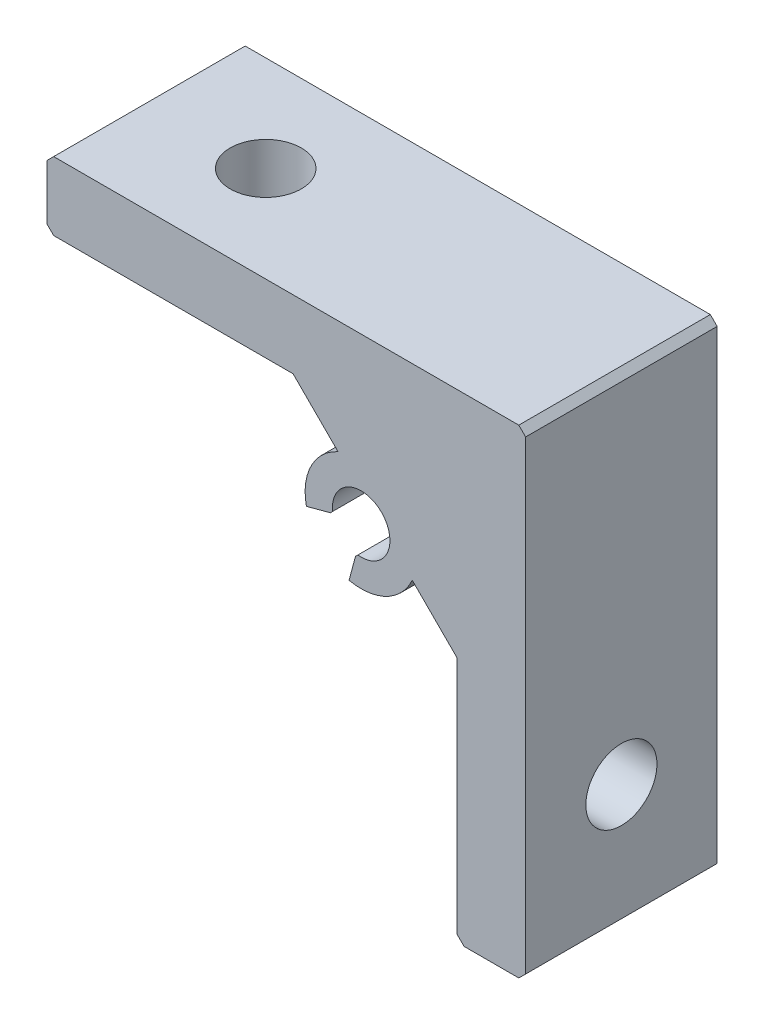
ISO-10303-21;
HEADER;
FILE_DESCRIPTION(('STEP AP214'),'2;1');
FILE_NAME('part.step','',(''),(''),'','','');
FILE_SCHEMA(('AUTOMOTIVE_DESIGN { 1 0 10303 214 1 1 1 1 }'));
ENDSEC;
DATA;
#1=APPLICATION_CONTEXT('core data for automotive mechanical design processes');
#2=APPLICATION_PROTOCOL_DEFINITION('international standard','automotive_design',2000,#1);
#3=PRODUCT_CONTEXT('',#1,'mechanical');
#4=PRODUCT('Part','Part','',(#3));
#5=PRODUCT_RELATED_PRODUCT_CATEGORY('part','',(#4));
#6=PRODUCT_DEFINITION_FORMATION('','',#4);
#7=PRODUCT_DEFINITION_CONTEXT('part definition',#1,'design');
#8=PRODUCT_DEFINITION('design','',#6,#7);
#9=PRODUCT_DEFINITION_SHAPE('','',#8);
#10=(LENGTH_UNIT() NAMED_UNIT(*) SI_UNIT(.MILLI.,.METRE.));
#11=(NAMED_UNIT(*) PLANE_ANGLE_UNIT() SI_UNIT($,.RADIAN.));
#12=(NAMED_UNIT(*) SI_UNIT($,.STERADIAN.) SOLID_ANGLE_UNIT());
#13=UNCERTAINTY_MEASURE_WITH_UNIT(LENGTH_MEASURE(1.E-05),#10,'distance_accuracy_value','');
#14=(GEOMETRIC_REPRESENTATION_CONTEXT(3) GLOBAL_UNCERTAINTY_ASSIGNED_CONTEXT((#13)) GLOBAL_UNIT_ASSIGNED_CONTEXT((#10,
#11,#12)) REPRESENTATION_CONTEXT('',''));
#15=CARTESIAN_POINT('',(0.,0.,0.));
#16=DIRECTION('',(0.,0.,1.));
#17=DIRECTION('',(1.,0.,0.));
#18=AXIS2_PLACEMENT_3D('',#15,#16,#17);
#19=CARTESIAN_POINT('',(-14.1062444746829,-12.2677668435979,14.));
#20=DIRECTION('',(0.707106781186547,-0.707106781186548,0.));
#21=DIRECTION('',(0.707106781186548,0.707106781186547,0.));
#22=AXIS2_PLACEMENT_3D('',#19,#20,#21);
#23=PLANE('',#22);
#24=DIRECTION('',(0.,0.,-1.));
#25=VECTOR('',#24,1.);
#26=CARTESIAN_POINT('',(-14.1062444746829,-12.2677668435979,14.));
#27=LINE('',#26,#25);
#28=CARTESIAN_POINT('',(-14.1062444746829,-12.2677668435979,0.));
#29=VERTEX_POINT('',#28);
#30=CARTESIAN_POINT('',(-14.1062444746829,-12.2677668435979,14.));
#31=VERTEX_POINT('',#30);
#32=EDGE_CURVE('E228',#29,#31,#27,.F.);
#33=ORIENTED_EDGE('',*,*,#32,.T.);
#34=DIRECTION('',(0.707106781186548,0.707106781186547,0.));
#35=VECTOR('',#34,1.);
#36=CARTESIAN_POINT('',(-14.1062444746829,-12.2677668435979,14.));
#37=LINE('',#36,#35);
#38=CARTESIAN_POINT('',(-14.2753859503142,-12.4369083192292,14.));
#39=VERTEX_POINT('',#38);
#40=EDGE_CURVE('E286',#31,#39,#37,.F.);
#41=ORIENTED_EDGE('',*,*,#40,.T.);
#42=DIRECTION('',(0.,0.,1.));
#43=VECTOR('',#42,1.);
#44=CARTESIAN_POINT('',(-14.2753859503142,-12.4369083192292,14.));
#45=LINE('',#44,#43);
#46=CARTESIAN_POINT('',(-14.2753859503142,-12.4369083192292,0.));
#47=VERTEX_POINT('',#46);
#48=EDGE_CURVE('E168',#47,#39,#45,.T.);
#49=ORIENTED_EDGE('',*,*,#48,.F.);
#50=DIRECTION('',(0.707106781186548,0.707106781186547,0.));
#51=VECTOR('',#50,1.);
#52=CARTESIAN_POINT('',(-14.1062444746829,-12.2677668435979,0.));
#53=LINE('',#52,#51);
#54=EDGE_CURVE('E292',#47,#29,#53,.T.);
#55=ORIENTED_EDGE('',*,*,#54,.T.);
#56=EDGE_LOOP('',(#33,#41,#49,#55));
#57=FACE_BOUND('',#56,.T.);
#58=ADVANCED_FACE('F16',(#57),#23,.T.);
#59=CARTESIAN_POINT('',(-13.8511218816023,-15.6895995126873,14.));
#60=DIRECTION('',(-0.707106781186548,0.707106781186547,0.));
#61=DIRECTION('',(-0.707106781186547,-0.707106781186548,0.));
#62=AXIS2_PLACEMENT_3D('',#59,#60,#61);
#63=PLANE('',#62);
#64=DIRECTION('',(0.,0.,-1.));
#65=VECTOR('',#64,1.);
#66=CARTESIAN_POINT('',(-12.2677668435979,-14.1062444746829,14.));
#67=LINE('',#66,#65);
#68=CARTESIAN_POINT('',(-12.2677668435979,-14.1062444746829,14.));
#69=VERTEX_POINT('',#68);
#70=CARTESIAN_POINT('',(-12.2677668435979,-14.1062444746829,0.));
#71=VERTEX_POINT('',#70);
#72=EDGE_CURVE('E167',#69,#71,#67,.T.);
#73=ORIENTED_EDGE('',*,*,#72,.T.);
#74=DIRECTION('',(-0.707106781186547,-0.707106781186548,0.));
#75=VECTOR('',#74,1.);
#76=CARTESIAN_POINT('',(-13.8511218816023,-15.6895995126873,0.));
#77=LINE('',#76,#75);
#78=CARTESIAN_POINT('',(-12.4369083192292,-14.2753859503142,0.));
#79=VERTEX_POINT('',#78);
#80=EDGE_CURVE('E283',#71,#79,#77,.T.);
#81=ORIENTED_EDGE('',*,*,#80,.T.);
#82=DIRECTION('',(0.,0.,1.));
#83=VECTOR('',#82,1.);
#84=CARTESIAN_POINT('',(-12.4369083192292,-14.2753859503142,14.));
#85=LINE('',#84,#83);
#86=CARTESIAN_POINT('',(-12.4369083192292,-14.2753859503142,14.));
#87=VERTEX_POINT('',#86);
#88=EDGE_CURVE('E225',#87,#79,#85,.F.);
#89=ORIENTED_EDGE('',*,*,#88,.F.);
#90=DIRECTION('',(-0.707106781186547,-0.707106781186548,0.));
#91=VECTOR('',#90,1.);
#92=CARTESIAN_POINT('',(-13.8511218816023,-15.6895995126873,14.));
#93=LINE('',#92,#91);
#94=EDGE_CURVE('E284',#87,#69,#93,.F.);
#95=ORIENTED_EDGE('',*,*,#94,.T.);
#96=EDGE_LOOP('',(#73,#81,#89,#95));
#97=FACE_BOUND('',#96,.T.);
#98=ADVANCED_FACE('F457',(#97),#63,.T.);
#99=CARTESIAN_POINT('',(-4.75,-34.75,0.));
#100=DIRECTION('',(-0.707106781186546,-0.707106781186549,0.));
#101=DIRECTION('',(0.707106781186549,-0.707106781186546,0.));
#102=AXIS2_PLACEMENT_3D('',#99,#100,#101);
#103=PLANE('',#102);
#104=DIRECTION('',(0.707106781186549,-0.707106781186546,0.));
#105=VECTOR('',#104,1.);
#106=CARTESIAN_POINT('',(-4.75,-34.75,0.));
#107=LINE('',#106,#105);
#108=CARTESIAN_POINT('',(-5.,-34.5,0.));
#109=VERTEX_POINT('',#108);
#110=CARTESIAN_POINT('',(-4.5,-35.,0.));
#111=VERTEX_POINT('',#110);
#112=EDGE_CURVE('E279',#109,#111,#107,.T.);
#113=ORIENTED_EDGE('',*,*,#112,.T.);
#114=DIRECTION('',(0.,0.,-1.));
#115=VECTOR('',#114,1.);
#116=CARTESIAN_POINT('',(-4.5,-35.,0.));
#117=LINE('',#116,#115);
#118=CARTESIAN_POINT('',(-4.5,-35.,14.));
#119=VERTEX_POINT('',#118);
#120=EDGE_CURVE('E195',#119,#111,#117,.T.);
#121=ORIENTED_EDGE('',*,*,#120,.F.);
#122=DIRECTION('',(0.707106781186549,-0.707106781186546,0.));
#123=VECTOR('',#122,1.);
#124=CARTESIAN_POINT('',(-4.75,-34.75,14.));
#125=LINE('',#124,#123);
#126=CARTESIAN_POINT('',(-5.,-34.5,14.));
#127=VERTEX_POINT('',#126);
#128=EDGE_CURVE('E281',#119,#127,#125,.F.);
#129=ORIENTED_EDGE('',*,*,#128,.T.);
#130=DIRECTION('',(0.,0.,1.));
#131=VECTOR('',#130,1.);
#132=CARTESIAN_POINT('',(-5.,-34.5,0.));
#133=LINE('',#132,#131);
#134=EDGE_CURVE('E203',#109,#127,#133,.T.);
#135=ORIENTED_EDGE('',*,*,#134,.F.);
#136=EDGE_LOOP('',(#113,#121,#129,#135));
#137=FACE_BOUND('',#136,.T.);
#138=ADVANCED_FACE('F472',(#137),#103,.T.);
#139=CARTESIAN_POINT('',(-0.25,-34.75,0.));
#140=DIRECTION('',(0.707106781186546,-0.707106781186549,0.));
#141=DIRECTION('',(0.707106781186549,0.707106781186546,0.));
#142=AXIS2_PLACEMENT_3D('',#139,#140,#141);
#143=PLANE('',#142);
#144=DIRECTION('',(0.707106781186549,0.707106781186546,0.));
#145=VECTOR('',#144,1.);
#146=CARTESIAN_POINT('',(-0.25,-34.75,0.));
#147=LINE('',#146,#145);
#148=CARTESIAN_POINT('',(-0.5,-35.,0.));
#149=VERTEX_POINT('',#148);
#150=CARTESIAN_POINT('',(0.,-34.5,0.));
#151=VERTEX_POINT('',#150);
#152=EDGE_CURVE('E270',#149,#151,#147,.T.);
#153=ORIENTED_EDGE('',*,*,#152,.T.);
#154=DIRECTION('',(0.,0.,-1.));
#155=VECTOR('',#154,1.);
#156=CARTESIAN_POINT('',(0.,-34.5,0.));
#157=LINE('',#156,#155);
#158=CARTESIAN_POINT('',(0.,-34.5,14.));
#159=VERTEX_POINT('',#158);
#160=EDGE_CURVE('E191',#159,#151,#157,.T.);
#161=ORIENTED_EDGE('',*,*,#160,.F.);
#162=DIRECTION('',(0.707106781186549,0.707106781186546,0.));
#163=VECTOR('',#162,1.);
#164=CARTESIAN_POINT('',(-0.25,-34.75,14.));
#165=LINE('',#164,#163);
#166=CARTESIAN_POINT('',(-0.5,-35.,14.));
#167=VERTEX_POINT('',#166);
#168=EDGE_CURVE('E277',#159,#167,#165,.F.);
#169=ORIENTED_EDGE('',*,*,#168,.T.);
#170=DIRECTION('',(0.,0.,-1.));
#171=VECTOR('',#170,1.);
#172=CARTESIAN_POINT('',(-0.5,-35.,0.));
#173=LINE('',#172,#171);
#174=EDGE_CURVE('E200',#149,#167,#173,.F.);
#175=ORIENTED_EDGE('',*,*,#174,.F.);
#176=EDGE_LOOP('',(#153,#161,#169,#175));
#177=FACE_BOUND('',#176,.T.);
#178=ADVANCED_FACE('F473',(#177),#143,.T.);
#179=CARTESIAN_POINT('',(0.,-26.,7.));
#180=DIRECTION('',(-1.,0.,0.));
#181=DIRECTION('',(0.,0.,1.));
#182=AXIS2_PLACEMENT_3D('',#179,#180,#181);
#183=CYLINDRICAL_SURFACE('',#182,2.6);
#184=CARTESIAN_POINT('',(0.,-26.,7.));
#185=DIRECTION('',(-1.,0.,0.));
#186=DIRECTION('',(0.,0.,1.));
#187=AXIS2_PLACEMENT_3D('',#184,#185,#186);
#188=CIRCLE('',#187,2.6);
#189=CARTESIAN_POINT('',(0.,-26.,9.6));
#190=VERTEX_POINT('',#189);
#191=EDGE_CURVE('E187',#190,#190,#188,.T.);
#192=ORIENTED_EDGE('',*,*,#191,.F.);
#193=EDGE_LOOP('',(#192));
#194=FACE_BOUND('',#193,.T.);
#195=CARTESIAN_POINT('',(-5.,-26.,7.));
#196=DIRECTION('',(-1.,0.,0.));
#197=DIRECTION('',(0.,0.,1.));
#198=AXIS2_PLACEMENT_3D('',#195,#196,#197);
#199=CIRCLE('',#198,2.6);
#200=CARTESIAN_POINT('',(-5.,-26.,9.6));
#201=VERTEX_POINT('',#200);
#202=EDGE_CURVE('E193',#201,#201,#199,.F.);
#203=ORIENTED_EDGE('',*,*,#202,.F.);
#204=EDGE_LOOP('',(#203));
#205=FACE_BOUND('',#204,.T.);
#206=ADVANCED_FACE('F506',(#194,#205),#183,.F.);
#207=CARTESIAN_POINT('',(-34.75,-4.75,0.));
#208=DIRECTION('',(-0.707106781186549,-0.707106781186546,0.));
#209=DIRECTION('',(0.707106781186546,-0.707106781186549,0.));
#210=AXIS2_PLACEMENT_3D('',#207,#208,#209);
#211=PLANE('',#210);
#212=DIRECTION('',(0.707106781186546,-0.707106781186549,0.));
#213=VECTOR('',#212,1.);
#214=CARTESIAN_POINT('',(-34.75,-4.75,0.));
#215=LINE('',#214,#213);
#216=CARTESIAN_POINT('',(-35.,-4.5,0.));
#217=VERTEX_POINT('',#216);
#218=CARTESIAN_POINT('',(-34.5,-5.,0.));
#219=VERTEX_POINT('',#218);
#220=EDGE_CURVE('E269',#217,#219,#215,.T.);
#221=ORIENTED_EDGE('',*,*,#220,.T.);
#222=DIRECTION('',(0.,0.,-1.));
#223=VECTOR('',#222,1.);
#224=CARTESIAN_POINT('',(-34.5,-5.,0.));
#225=LINE('',#224,#223);
#226=CARTESIAN_POINT('',(-34.5,-5.,14.));
#227=VERTEX_POINT('',#226);
#228=EDGE_CURVE('E190',#227,#219,#225,.T.);
#229=ORIENTED_EDGE('',*,*,#228,.F.);
#230=DIRECTION('',(0.707106781186546,-0.707106781186549,0.));
#231=VECTOR('',#230,1.);
#232=CARTESIAN_POINT('',(-34.75,-4.75,14.));
#233=LINE('',#232,#231);
#234=CARTESIAN_POINT('',(-35.,-4.5,14.));
#235=VERTEX_POINT('',#234);
#236=EDGE_CURVE('E267',#227,#235,#233,.F.);
#237=ORIENTED_EDGE('',*,*,#236,.T.);
#238=DIRECTION('',(0.,0.,1.));
#239=VECTOR('',#238,1.);
#240=CARTESIAN_POINT('',(-35.,-4.5,0.));
#241=LINE('',#240,#239);
#242=EDGE_CURVE('E239',#217,#235,#241,.T.);
#243=ORIENTED_EDGE('',*,*,#242,.F.);
#244=EDGE_LOOP('',(#221,#229,#237,#243));
#245=FACE_BOUND('',#244,.T.);
#246=ADVANCED_FACE('F447',(#245),#211,.T.);
#247=CARTESIAN_POINT('',(-35.,0.,0.));
#248=DIRECTION('',(-1.,0.,0.));
#249=DIRECTION('',(0.,0.,1.));
#250=AXIS2_PLACEMENT_3D('',#247,#248,#249);
#251=PLANE('',#250);
#252=ORIENTED_EDGE('',*,*,#242,.T.);
#253=DIRECTION('',(0.,1.,0.));
#254=VECTOR('',#253,1.);
#255=CARTESIAN_POINT('',(-35.,-11.616677844367,14.));
#256=LINE('',#255,#254);
#257=CARTESIAN_POINT('',(-35.,-0.500000000000001,14.));
#258=VERTEX_POINT('',#257);
#259=EDGE_CURVE('E264',#258,#235,#256,.F.);
#260=ORIENTED_EDGE('',*,*,#259,.F.);
#261=DIRECTION('',(0.,0.,1.));
#262=VECTOR('',#261,1.);
#263=CARTESIAN_POINT('',(-35.,-0.500000000000001,0.));
#264=LINE('',#263,#262);
#265=CARTESIAN_POINT('',(-35.,-0.499999999999999,0.));
#266=VERTEX_POINT('',#265);
#267=EDGE_CURVE('E249',#266,#258,#264,.T.);
#268=ORIENTED_EDGE('',*,*,#267,.F.);
#269=DIRECTION('',(0.,1.,0.));
#270=VECTOR('',#269,1.);
#271=CARTESIAN_POINT('',(-35.,-11.616677844367,0.));
#272=LINE('',#271,#270);
#273=EDGE_CURVE('E244',#266,#217,#272,.F.);
#274=ORIENTED_EDGE('',*,*,#273,.T.);
#275=EDGE_LOOP('',(#252,#260,#268,#274));
#276=FACE_BOUND('',#275,.T.);
#277=ADVANCED_FACE('F500',(#276),#251,.T.);
#278=CARTESIAN_POINT('',(-17.,-5.,0.));
#279=DIRECTION('',(-0.707106781186547,-0.707106781186548,0.));
#280=DIRECTION('',(0.707106781186548,-0.707106781186547,0.));
#281=AXIS2_PLACEMENT_3D('',#278,#279,#280);
#282=PLANE('',#281);
#283=DIRECTION('',(0.,0.,-1.));
#284=VECTOR('',#283,1.);
#285=CARTESIAN_POINT('',(-17.,-5.,0.));
#286=LINE('',#285,#284);
#287=CARTESIAN_POINT('',(-17.,-5.,0.));
#288=VERTEX_POINT('',#287);
#289=CARTESIAN_POINT('',(-17.,-5.,14.));
#290=VERTEX_POINT('',#289);
#291=EDGE_CURVE('E247',#288,#290,#286,.F.);
#292=ORIENTED_EDGE('',*,*,#291,.F.);
#293=DIRECTION('',(0.707106781186544,-0.707106781186551,0.));
#294=VECTOR('',#293,1.);
#295=CARTESIAN_POINT('',(-17.,-5.,0.));
#296=LINE('',#295,#294);
#297=CARTESIAN_POINT('',(-13.7134730814528,-8.28652691854724,0.));
#298=VERTEX_POINT('',#297);
#299=EDGE_CURVE('E243',#288,#298,#296,.T.);
#300=ORIENTED_EDGE('',*,*,#299,.T.);
#301=DIRECTION('',(0.,0.,-1.));
#302=VECTOR('',#301,1.);
#303=CARTESIAN_POINT('',(-13.7134730814528,-8.28652691854724,14.));
#304=LINE('',#303,#302);
#305=CARTESIAN_POINT('',(-13.7134730814528,-8.28652691854724,14.));
#306=VERTEX_POINT('',#305);
#307=EDGE_CURVE('E151',#306,#298,#304,.T.);
#308=ORIENTED_EDGE('',*,*,#307,.F.);
#309=DIRECTION('',(0.707106781186544,-0.707106781186551,0.));
#310=VECTOR('',#309,1.);
#311=CARTESIAN_POINT('',(-17.,-5.,14.));
#312=LINE('',#311,#310);
#313=EDGE_CURVE('E180',#290,#306,#312,.T.);
#314=ORIENTED_EDGE('',*,*,#313,.F.);
#315=EDGE_LOOP('',(#292,#300,#308,#314));
#316=FACE_BOUND('',#315,.T.);
#317=ADVANCED_FACE('F443',(#316),#282,.T.);
#318=CARTESIAN_POINT('',(-12.0208152801713,-12.0208152801713,14.));
#319=DIRECTION('',(0.,0.,-1.));
#320=DIRECTION('',(-1.,0.,0.));
#321=AXIS2_PLACEMENT_3D('',#318,#319,#320);
#322=CYLINDRICAL_SURFACE('',#321,4.1);
#323=ORIENTED_EDGE('',*,*,#307,.T.);
#324=CARTESIAN_POINT('',(-12.0208152801713,-12.0208152801713,0.));
#325=DIRECTION('',(0.,0.,-1.));
#326=DIRECTION('',(-1.,0.,0.));
#327=AXIS2_PLACEMENT_3D('',#324,#325,#326);
#328=CIRCLE('',#327,4.1);
#329=CARTESIAN_POINT('',(-16.0242283984794,-12.9055092409051,0.));
#330=VERTEX_POINT('',#329);
#331=EDGE_CURVE('E163',#298,#330,#328,.F.);
#332=ORIENTED_EDGE('',*,*,#331,.T.);
#333=DIRECTION('',(0.,0.,1.));
#334=VECTOR('',#333,1.);
#335=CARTESIAN_POINT('',(-16.0242283984794,-12.9055092409052,14.));
#336=LINE('',#335,#334);
#337=CARTESIAN_POINT('',(-16.0242283984794,-12.9055092409051,14.));
#338=VERTEX_POINT('',#337);
#339=EDGE_CURVE('E156',#338,#330,#336,.F.);
#340=ORIENTED_EDGE('',*,*,#339,.F.);
#341=CARTESIAN_POINT('',(-12.0208152801713,-12.0208152801713,14.));
#342=DIRECTION('',(0.,0.,-1.));
#343=DIRECTION('',(-1.,0.,0.));
#344=AXIS2_PLACEMENT_3D('',#341,#342,#343);
#345=CIRCLE('',#344,4.1);
#346=EDGE_CURVE('E160',#306,#338,#345,.F.);
#347=ORIENTED_EDGE('',*,*,#346,.F.);
#348=EDGE_LOOP('',(#323,#332,#340,#347));
#349=FACE_BOUND('',#348,.T.);
#350=ADVANCED_FACE('F158',(#349),#322,.T.);
#351=CARTESIAN_POINT('',(-15.1498071743968,-12.6712087800672,14.));
#352=DIRECTION('',(0.258819045102932,-0.965925826288958,0.));
#353=DIRECTION('',(0.965925826288958,0.258819045102932,0.));
#354=AXIS2_PLACEMENT_3D('',#351,#352,#353);
#355=PLANE('',#354);
#356=DIRECTION('',(0.965925826288962,0.258819045102916,0.));
#357=VECTOR('',#356,1.);
#358=CARTESIAN_POINT('',(-16.0242283984794,-12.9055092409051,14.));
#359=LINE('',#358,#357);
#360=EDGE_CURVE('E172',#338,#39,#359,.T.);
#361=ORIENTED_EDGE('',*,*,#360,.F.);
#362=ORIENTED_EDGE('',*,*,#339,.T.);
#363=DIRECTION('',(0.965925826288962,0.258819045102916,0.));
#364=VECTOR('',#363,1.);
#365=CARTESIAN_POINT('',(-16.0242283984794,-12.9055092409051,0.));
#366=LINE('',#365,#364);
#367=EDGE_CURVE('E328',#330,#47,#366,.T.);
#368=ORIENTED_EDGE('',*,*,#367,.T.);
#369=ORIENTED_EDGE('',*,*,#48,.T.);
#370=EDGE_LOOP('',(#361,#362,#368,#369));
#371=FACE_BOUND('',#370,.T.);
#372=ADVANCED_FACE('F173',(#371),#355,.T.);
#373=CARTESIAN_POINT('',(-12.0208152801713,-12.0208152801713,14.));
#374=DIRECTION('',(0.,0.,-1.));
#375=DIRECTION('',(-1.,0.,0.));
#376=AXIS2_PLACEMENT_3D('',#373,#374,#375);
#377=CYLINDRICAL_SURFACE('',#376,2.1);
#378=ORIENTED_EDGE('',*,*,#32,.F.);
#379=CARTESIAN_POINT('',(-12.0208152801713,-12.0208152801713,0.));
#380=DIRECTION('',(0.,0.,-1.));
#381=DIRECTION('',(-1.,0.,0.));
#382=AXIS2_PLACEMENT_3D('',#379,#380,#381);
#383=CIRCLE('',#382,2.1);
#384=EDGE_CURVE('E325',#29,#71,#383,.T.);
#385=ORIENTED_EDGE('',*,*,#384,.T.);
#386=ORIENTED_EDGE('',*,*,#72,.F.);
#387=CARTESIAN_POINT('',(-12.0208152801713,-12.0208152801713,14.));
#388=DIRECTION('',(0.,0.,-1.));
#389=DIRECTION('',(-1.,0.,0.));
#390=AXIS2_PLACEMENT_3D('',#387,#388,#389);
#391=CIRCLE('',#390,2.1);
#392=EDGE_CURVE('E176',#31,#69,#391,.T.);
#393=ORIENTED_EDGE('',*,*,#392,.F.);
#394=EDGE_LOOP('',(#378,#385,#386,#393));
#395=FACE_BOUND('',#394,.T.);
#396=ADVANCED_FACE('F455',(#395),#377,.F.);
#397=CARTESIAN_POINT('',(-12.6712087800672,-15.1498071743968,14.));
#398=DIRECTION('',(-0.965925826288958,0.258819045102931,0.));
#399=DIRECTION('',(-0.258819045102931,-0.965925826288958,0.));
#400=AXIS2_PLACEMENT_3D('',#397,#398,#399);
#401=PLANE('',#400);
#402=DIRECTION('',(-0.258819045102916,-0.965925826288962,0.));
#403=VECTOR('',#402,1.);
#404=CARTESIAN_POINT('',(-12.4369083192292,-14.2753859503142,14.));
#405=LINE('',#404,#403);
#406=CARTESIAN_POINT('',(-12.9055092409051,-16.0242283984794,14.));
#407=VERTEX_POINT('',#406);
#408=EDGE_CURVE('E331',#87,#407,#405,.T.);
#409=ORIENTED_EDGE('',*,*,#408,.F.);
#410=ORIENTED_EDGE('',*,*,#88,.T.);
#411=DIRECTION('',(-0.258819045102916,-0.965925826288962,0.));
#412=VECTOR('',#411,1.);
#413=CARTESIAN_POINT('',(-12.4369083192292,-14.2753859503142,0.));
#414=LINE('',#413,#412);
#415=CARTESIAN_POINT('',(-12.9055092409051,-16.0242283984794,0.));
#416=VERTEX_POINT('',#415);
#417=EDGE_CURVE('E324',#79,#416,#414,.T.);
#418=ORIENTED_EDGE('',*,*,#417,.T.);
#419=DIRECTION('',(0.,0.,-1.));
#420=VECTOR('',#419,1.);
#421=CARTESIAN_POINT('',(-12.9055092409051,-16.0242283984794,14.));
#422=LINE('',#421,#420);
#423=EDGE_CURVE('E222',#407,#416,#422,.T.);
#424=ORIENTED_EDGE('',*,*,#423,.F.);
#425=EDGE_LOOP('',(#409,#410,#418,#424));
#426=FACE_BOUND('',#425,.T.);
#427=ADVANCED_FACE('F460',(#426),#401,.T.);
#428=CARTESIAN_POINT('',(-12.0208152801713,-12.0208152801713,14.));
#429=DIRECTION('',(0.,0.,-1.));
#430=DIRECTION('',(-1.,0.,0.));
#431=AXIS2_PLACEMENT_3D('',#428,#429,#430);
#432=CYLINDRICAL_SURFACE('',#431,4.1);
#433=DIRECTION('',(0.,0.,1.));
#434=VECTOR('',#433,1.);
#435=CARTESIAN_POINT('',(-8.28652691854721,-13.7134730814528,0.));
#436=LINE('',#435,#434);
#437=CARTESIAN_POINT('',(-8.28652691854722,-13.7134730814528,14.));
#438=VERTEX_POINT('',#437);
#439=CARTESIAN_POINT('',(-8.28652691854722,-13.7134730814528,0.));
#440=VERTEX_POINT('',#439);
#441=EDGE_CURVE('E210',#438,#440,#436,.F.);
#442=ORIENTED_EDGE('',*,*,#441,.F.);
#443=CARTESIAN_POINT('',(-12.0208152801713,-12.0208152801713,14.));
#444=DIRECTION('',(0.,0.,-1.));
#445=DIRECTION('',(-1.,0.,0.));
#446=AXIS2_PLACEMENT_3D('',#443,#444,#445);
#447=CIRCLE('',#446,4.1);
#448=EDGE_CURVE('E329',#407,#438,#447,.F.);
#449=ORIENTED_EDGE('',*,*,#448,.F.);
#450=ORIENTED_EDGE('',*,*,#423,.T.);
#451=CARTESIAN_POINT('',(-12.0208152801713,-12.0208152801713,0.));
#452=DIRECTION('',(0.,0.,-1.));
#453=DIRECTION('',(-1.,0.,0.));
#454=AXIS2_PLACEMENT_3D('',#451,#452,#453);
#455=CIRCLE('',#454,4.1);
#456=EDGE_CURVE('E322',#416,#440,#455,.F.);
#457=ORIENTED_EDGE('',*,*,#456,.T.);
#458=EDGE_LOOP('',(#442,#449,#450,#457));
#459=FACE_BOUND('',#458,.T.);
#460=ADVANCED_FACE('F463',(#459),#432,.T.);
#461=CARTESIAN_POINT('',(-17.,-5.,0.));
#462=DIRECTION('',(-0.707106781186547,-0.707106781186548,0.));
#463=DIRECTION('',(0.707106781186548,-0.707106781186547,0.));
#464=AXIS2_PLACEMENT_3D('',#461,#462,#463);
#465=PLANE('',#464);
#466=DIRECTION('',(0.,0.,1.));
#467=VECTOR('',#466,1.);
#468=CARTESIAN_POINT('',(-5.,-17.,0.));
#469=LINE('',#468,#467);
#470=CARTESIAN_POINT('',(-5.,-17.,14.));
#471=VERTEX_POINT('',#470);
#472=CARTESIAN_POINT('',(-5.,-17.,0.));
#473=VERTEX_POINT('',#472);
#474=EDGE_CURVE('E196',#471,#473,#469,.F.);
#475=ORIENTED_EDGE('',*,*,#474,.F.);
#476=DIRECTION('',(0.707106781186551,-0.707106781186544,0.));
#477=VECTOR('',#476,1.);
#478=CARTESIAN_POINT('',(-8.28652691854723,-13.7134730814528,14.));
#479=LINE('',#478,#477);
#480=EDGE_CURVE('E260',#438,#471,#479,.T.);
#481=ORIENTED_EDGE('',*,*,#480,.F.);
#482=ORIENTED_EDGE('',*,*,#441,.T.);
#483=DIRECTION('',(0.707106781186551,-0.707106781186544,0.));
#484=VECTOR('',#483,1.);
#485=CARTESIAN_POINT('',(-8.28652691854723,-13.7134730814528,0.));
#486=LINE('',#485,#484);
#487=EDGE_CURVE('E219',#440,#473,#486,.T.);
#488=ORIENTED_EDGE('',*,*,#487,.T.);
#489=EDGE_LOOP('',(#475,#481,#482,#488));
#490=FACE_BOUND('',#489,.T.);
#491=ADVANCED_FACE('F468',(#490),#465,.T.);
#492=CARTESIAN_POINT('',(-5.,-17.,0.));
#493=DIRECTION('',(-1.,0.,0.));
#494=DIRECTION('',(0.,0.,1.));
#495=AXIS2_PLACEMENT_3D('',#492,#493,#494);
#496=PLANE('',#495);
#497=ORIENTED_EDGE('',*,*,#202,.T.);
#498=EDGE_LOOP('',(#497));
#499=FACE_BOUND('',#498,.T.);
#500=ORIENTED_EDGE('',*,*,#474,.T.);
#501=DIRECTION('',(0.,1.,0.));
#502=VECTOR('',#501,1.);
#503=CARTESIAN_POINT('',(-5.,-11.616677844367,0.));
#504=LINE('',#503,#502);
#505=EDGE_CURVE('E216',#473,#109,#504,.F.);
#506=ORIENTED_EDGE('',*,*,#505,.T.);
#507=ORIENTED_EDGE('',*,*,#134,.T.);
#508=DIRECTION('',(0.,1.,0.));
#509=VECTOR('',#508,1.);
#510=CARTESIAN_POINT('',(-5.,-11.616677844367,14.));
#511=LINE('',#510,#509);
#512=EDGE_CURVE('E256',#471,#127,#511,.F.);
#513=ORIENTED_EDGE('',*,*,#512,.F.);
#514=EDGE_LOOP('',(#500,#506,#507,#513));
#515=FACE_BOUND('',#514,.T.);
#516=ADVANCED_FACE('F469',(#499,#515),#496,.T.);
#517=CARTESIAN_POINT('',(-5.,-35.,0.));
#518=DIRECTION('',(0.,-1.,0.));
#519=DIRECTION('',(0.,0.,-1.));
#520=AXIS2_PLACEMENT_3D('',#517,#518,#519);
#521=PLANE('',#520);
#522=ORIENTED_EDGE('',*,*,#174,.T.);
#523=DIRECTION('',(1.,0.,0.));
#524=VECTOR('',#523,1.);
#525=CARTESIAN_POINT('',(-11.616677844367,-35.,14.));
#526=LINE('',#525,#524);
#527=EDGE_CURVE('E259',#119,#167,#526,.T.);
#528=ORIENTED_EDGE('',*,*,#527,.F.);
#529=ORIENTED_EDGE('',*,*,#120,.T.);
#530=DIRECTION('',(1.,0.,0.));
#531=VECTOR('',#530,1.);
#532=CARTESIAN_POINT('',(-11.616677844367,-35.,0.));
#533=LINE('',#532,#531);
#534=EDGE_CURVE('E218',#111,#149,#533,.T.);
#535=ORIENTED_EDGE('',*,*,#534,.T.);
#536=EDGE_LOOP('',(#522,#528,#529,#535));
#537=FACE_BOUND('',#536,.T.);
#538=ADVANCED_FACE('F359',(#537),#521,.T.);
#539=CARTESIAN_POINT('',(0.,-35.,0.));
#540=DIRECTION('',(1.,0.,0.));
#541=DIRECTION('',(0.,0.,-1.));
#542=AXIS2_PLACEMENT_3D('',#539,#540,#541);
#543=PLANE('',#542);
#544=ORIENTED_EDGE('',*,*,#191,.T.);
#545=EDGE_LOOP('',(#544));
#546=FACE_BOUND('',#545,.T.);
#547=DIRECTION('',(0.,0.,1.));
#548=VECTOR('',#547,1.);
#549=CARTESIAN_POINT('',(0.,-0.499999999999999,0.));
#550=LINE('',#549,#548);
#551=CARTESIAN_POINT('',(0.,-0.499999999999999,14.));
#552=VERTEX_POINT('',#551);
#553=CARTESIAN_POINT('',(0.,-0.499999999999999,0.));
#554=VERTEX_POINT('',#553);
#555=EDGE_CURVE('E305',#552,#554,#550,.F.);
#556=ORIENTED_EDGE('',*,*,#555,.F.);
#557=DIRECTION('',(0.,1.,0.));
#558=VECTOR('',#557,1.);
#559=CARTESIAN_POINT('',(0.,-11.616677844367,14.));
#560=LINE('',#559,#558);
#561=EDGE_CURVE('E364',#159,#552,#560,.T.);
#562=ORIENTED_EDGE('',*,*,#561,.F.);
#563=ORIENTED_EDGE('',*,*,#160,.T.);
#564=DIRECTION('',(0.,1.,0.));
#565=VECTOR('',#564,1.);
#566=CARTESIAN_POINT('',(0.,-11.616677844367,0.));
#567=LINE('',#566,#565);
#568=EDGE_CURVE('E385',#151,#554,#567,.T.);
#569=ORIENTED_EDGE('',*,*,#568,.T.);
#570=EDGE_LOOP('',(#556,#562,#563,#569));
#571=FACE_BOUND('',#570,.T.);
#572=ADVANCED_FACE('F438',(#546,#571),#543,.T.);
#573=CARTESIAN_POINT('',(-35.,-5.,0.));
#574=DIRECTION('',(0.,-1.,0.));
#575=DIRECTION('',(0.,0.,-1.));
#576=AXIS2_PLACEMENT_3D('',#573,#574,#575);
#577=PLANE('',#576);
#578=CARTESIAN_POINT('',(-26.,-5.,7.));
#579=DIRECTION('',(0.,-1.,0.));
#580=DIRECTION('',(0.,0.,-1.));
#581=AXIS2_PLACEMENT_3D('',#578,#579,#580);
#582=CIRCLE('',#581,2.6);
#583=CARTESIAN_POINT('',(-26.,-5.,4.4));
#584=VERTEX_POINT('',#583);
#585=EDGE_CURVE('E315',#584,#584,#582,.F.);
#586=ORIENTED_EDGE('',*,*,#585,.T.);
#587=EDGE_LOOP('',(#586));
#588=FACE_BOUND('',#587,.T.);
#589=ORIENTED_EDGE('',*,*,#291,.T.);
#590=DIRECTION('',(1.,0.,0.));
#591=VECTOR('',#590,1.);
#592=CARTESIAN_POINT('',(-11.616677844367,-5.,14.));
#593=LINE('',#592,#591);
#594=EDGE_CURVE('E182',#227,#290,#593,.T.);
#595=ORIENTED_EDGE('',*,*,#594,.F.);
#596=ORIENTED_EDGE('',*,*,#228,.T.);
#597=DIRECTION('',(1.,0.,0.));
#598=VECTOR('',#597,1.);
#599=CARTESIAN_POINT('',(-11.616677844367,-5.,0.));
#600=LINE('',#599,#598);
#601=EDGE_CURVE('E240',#219,#288,#600,.T.);
#602=ORIENTED_EDGE('',*,*,#601,.T.);
#603=EDGE_LOOP('',(#589,#595,#596,#602));
#604=FACE_BOUND('',#603,.T.);
#605=ADVANCED_FACE('F435',(#588,#604),#577,.T.);
#606=CARTESIAN_POINT('',(-34.75,-0.25,0.));
#607=DIRECTION('',(-0.707106781186549,0.707106781186546,0.));
#608=DIRECTION('',(-0.707106781186546,-0.707106781186549,0.));
#609=AXIS2_PLACEMENT_3D('',#606,#607,#608);
#610=PLANE('',#609);
#611=DIRECTION('',(-0.707106781186547,-0.707106781186547,0.));
#612=VECTOR('',#611,1.);
#613=CARTESIAN_POINT('',(-34.5,0.,0.));
#614=LINE('',#613,#612);
#615=CARTESIAN_POINT('',(-34.5,0.,0.));
#616=VERTEX_POINT('',#615);
#617=EDGE_CURVE('E319',#616,#266,#614,.T.);
#618=ORIENTED_EDGE('',*,*,#617,.T.);
#619=ORIENTED_EDGE('',*,*,#267,.T.);
#620=DIRECTION('',(-0.707106781186547,-0.707106781186547,0.));
#621=VECTOR('',#620,1.);
#622=CARTESIAN_POINT('',(-34.5,0.,14.));
#623=LINE('',#622,#621);
#624=CARTESIAN_POINT('',(-34.5,0.,14.));
#625=VERTEX_POINT('',#624);
#626=EDGE_CURVE('E310',#625,#258,#623,.T.);
#627=ORIENTED_EDGE('',*,*,#626,.F.);
#628=DIRECTION('',(0.,0.,1.));
#629=VECTOR('',#628,1.);
#630=CARTESIAN_POINT('',(-34.5,0.,0.));
#631=LINE('',#630,#629);
#632=EDGE_CURVE('E318',#616,#625,#631,.T.);
#633=ORIENTED_EDGE('',*,*,#632,.F.);
#634=EDGE_LOOP('',(#618,#619,#627,#633));
#635=FACE_BOUND('',#634,.T.);
#636=ADVANCED_FACE('F407',(#635),#610,.T.);
#637=CARTESIAN_POINT('',(-11.616677844367,-11.616677844367,14.));
#638=DIRECTION('',(0.,0.,1.));
#639=DIRECTION('',(1.,0.,0.));
#640=AXIS2_PLACEMENT_3D('',#637,#638,#639);
#641=PLANE('',#640);
#642=DIRECTION('',(-0.707106781186547,0.707106781186548,0.));
#643=VECTOR('',#642,1.);
#644=CARTESIAN_POINT('',(-0.25,-0.25,14.));
#645=LINE('',#644,#643);
#646=CARTESIAN_POINT('',(-0.5,0.,14.));
#647=VERTEX_POINT('',#646);
#648=EDGE_CURVE('E366',#647,#552,#645,.F.);
#649=ORIENTED_EDGE('',*,*,#648,.F.);
#650=DIRECTION('',(1.,0.,0.));
#651=VECTOR('',#650,1.);
#652=CARTESIAN_POINT('',(0.,0.,14.));
#653=LINE('',#652,#651);
#654=EDGE_CURVE('E392',#625,#647,#653,.T.);
#655=ORIENTED_EDGE('',*,*,#654,.F.);
#656=ORIENTED_EDGE('',*,*,#626,.T.);
#657=ORIENTED_EDGE('',*,*,#259,.T.);
#658=ORIENTED_EDGE('',*,*,#236,.F.);
#659=ORIENTED_EDGE('',*,*,#594,.T.);
#660=ORIENTED_EDGE('',*,*,#313,.T.);
#661=ORIENTED_EDGE('',*,*,#346,.T.);
#662=ORIENTED_EDGE('',*,*,#360,.T.);
#663=ORIENTED_EDGE('',*,*,#40,.F.);
#664=ORIENTED_EDGE('',*,*,#392,.T.);
#665=ORIENTED_EDGE('',*,*,#94,.F.);
#666=ORIENTED_EDGE('',*,*,#408,.T.);
#667=ORIENTED_EDGE('',*,*,#448,.T.);
#668=ORIENTED_EDGE('',*,*,#480,.T.);
#669=ORIENTED_EDGE('',*,*,#512,.T.);
#670=ORIENTED_EDGE('',*,*,#128,.F.);
#671=ORIENTED_EDGE('',*,*,#527,.T.);
#672=ORIENTED_EDGE('',*,*,#168,.F.);
#673=ORIENTED_EDGE('',*,*,#561,.T.);
#674=EDGE_LOOP('',(#649,#655,#656,#657,#658,#659,#660,#661,#662,#663,#664,#665,#666,#667,#668,
#669,#670,#671,#672,#673));
#675=FACE_BOUND('',#674,.T.);
#676=ADVANCED_FACE('F178',(#675),#641,.T.);
#677=CARTESIAN_POINT('',(-0.25,-0.25,0.));
#678=DIRECTION('',(0.707106781186548,0.707106781186547,0.));
#679=DIRECTION('',(-0.707106781186547,0.707106781186548,0.));
#680=AXIS2_PLACEMENT_3D('',#677,#678,#679);
#681=PLANE('',#680);
#682=DIRECTION('',(-0.707106781186549,0.707106781186546,0.));
#683=VECTOR('',#682,1.);
#684=CARTESIAN_POINT('',(0.,-0.499999999999999,0.));
#685=LINE('',#684,#683);
#686=CARTESIAN_POINT('',(-0.5,0.,0.));
#687=VERTEX_POINT('',#686);
#688=EDGE_CURVE('E34',#554,#687,#685,.T.);
#689=ORIENTED_EDGE('',*,*,#688,.T.);
#690=DIRECTION('',(0.,0.,1.));
#691=VECTOR('',#690,1.);
#692=CARTESIAN_POINT('',(-0.5,0.,0.));
#693=LINE('',#692,#691);
#694=EDGE_CURVE('E395',#647,#687,#693,.F.);
#695=ORIENTED_EDGE('',*,*,#694,.F.);
#696=ORIENTED_EDGE('',*,*,#648,.T.);
#697=ORIENTED_EDGE('',*,*,#555,.T.);
#698=EDGE_LOOP('',(#689,#695,#696,#697));
#699=FACE_BOUND('',#698,.T.);
#700=ADVANCED_FACE('F412',(#699),#681,.T.);
#701=CARTESIAN_POINT('',(-11.616677844367,-11.616677844367,0.));
#702=DIRECTION('',(0.,0.,1.));
#703=DIRECTION('',(1.,0.,0.));
#704=AXIS2_PLACEMENT_3D('',#701,#702,#703);
#705=PLANE('',#704);
#706=DIRECTION('',(1.,0.,0.));
#707=VECTOR('',#706,1.);
#708=CARTESIAN_POINT('',(0.,0.,0.));
#709=LINE('',#708,#707);
#710=EDGE_CURVE('E25',#687,#616,#709,.F.);
#711=ORIENTED_EDGE('',*,*,#710,.F.);
#712=ORIENTED_EDGE('',*,*,#688,.F.);
#713=ORIENTED_EDGE('',*,*,#568,.F.);
#714=ORIENTED_EDGE('',*,*,#152,.F.);
#715=ORIENTED_EDGE('',*,*,#534,.F.);
#716=ORIENTED_EDGE('',*,*,#112,.F.);
#717=ORIENTED_EDGE('',*,*,#505,.F.);
#718=ORIENTED_EDGE('',*,*,#487,.F.);
#719=ORIENTED_EDGE('',*,*,#456,.F.);
#720=ORIENTED_EDGE('',*,*,#417,.F.);
#721=ORIENTED_EDGE('',*,*,#80,.F.);
#722=ORIENTED_EDGE('',*,*,#384,.F.);
#723=ORIENTED_EDGE('',*,*,#54,.F.);
#724=ORIENTED_EDGE('',*,*,#367,.F.);
#725=ORIENTED_EDGE('',*,*,#331,.F.);
#726=ORIENTED_EDGE('',*,*,#299,.F.);
#727=ORIENTED_EDGE('',*,*,#601,.F.);
#728=ORIENTED_EDGE('',*,*,#220,.F.);
#729=ORIENTED_EDGE('',*,*,#273,.F.);
#730=ORIENTED_EDGE('',*,*,#617,.F.);
#731=EDGE_LOOP('',(#711,#712,#713,#714,#715,#716,#717,#718,#719,#720,#721,#722,#723,#724,#725,
#726,#727,#728,#729,#730));
#732=FACE_BOUND('',#731,.T.);
#733=ADVANCED_FACE('F403',(#732),#705,.F.);
#734=CARTESIAN_POINT('',(-26.,0.,7.));
#735=DIRECTION('',(0.,-1.,0.));
#736=DIRECTION('',(0.,0.,-1.));
#737=AXIS2_PLACEMENT_3D('',#734,#735,#736);
#738=CYLINDRICAL_SURFACE('',#737,2.6);
#739=CARTESIAN_POINT('',(-26.,0.,7.));
#740=DIRECTION('',(0.,-1.,0.));
#741=DIRECTION('',(0.,0.,-1.));
#742=AXIS2_PLACEMENT_3D('',#739,#740,#741);
#743=CIRCLE('',#742,2.6);
#744=CARTESIAN_POINT('',(-26.,0.,4.4));
#745=VERTEX_POINT('',#744);
#746=EDGE_CURVE('E11',#745,#745,#743,.T.);
#747=ORIENTED_EDGE('',*,*,#746,.F.);
#748=EDGE_LOOP('',(#747));
#749=FACE_BOUND('',#748,.T.);
#750=ORIENTED_EDGE('',*,*,#585,.F.);
#751=EDGE_LOOP('',(#750));
#752=FACE_BOUND('',#751,.T.);
#753=ADVANCED_FACE('F420',(#749,#752),#738,.F.);
#754=CARTESIAN_POINT('',(0.,0.,0.));
#755=DIRECTION('',(0.,1.,0.));
#756=DIRECTION('',(0.,0.,1.));
#757=AXIS2_PLACEMENT_3D('',#754,#755,#756);
#758=PLANE('',#757);
#759=ORIENTED_EDGE('',*,*,#746,.T.);
#760=EDGE_LOOP('',(#759));
#761=FACE_BOUND('',#760,.T.);
#762=ORIENTED_EDGE('',*,*,#694,.T.);
#763=ORIENTED_EDGE('',*,*,#710,.T.);
#764=ORIENTED_EDGE('',*,*,#632,.T.);
#765=ORIENTED_EDGE('',*,*,#654,.T.);
#766=EDGE_LOOP('',(#762,#763,#764,#765));
#767=FACE_BOUND('',#766,.T.);
#768=ADVANCED_FACE('F400',(#761,#767),#758,.T.);
#769=CLOSED_SHELL('',(#58,#98,#138,#178,#206,#246,#277,#317,#350,#372,#396,#427,#460,#491,#516,
#538,#572,#605,#636,#676,#700,#733,#753,#768));
#770=MANIFOLD_SOLID_BREP('B1',#769);
#771=ADVANCED_BREP_SHAPE_REPRESENTATION('',(#18,#770),#14);
#772=SHAPE_DEFINITION_REPRESENTATION(#9,#771);
ENDSEC;
END-ISO-10303-21;
